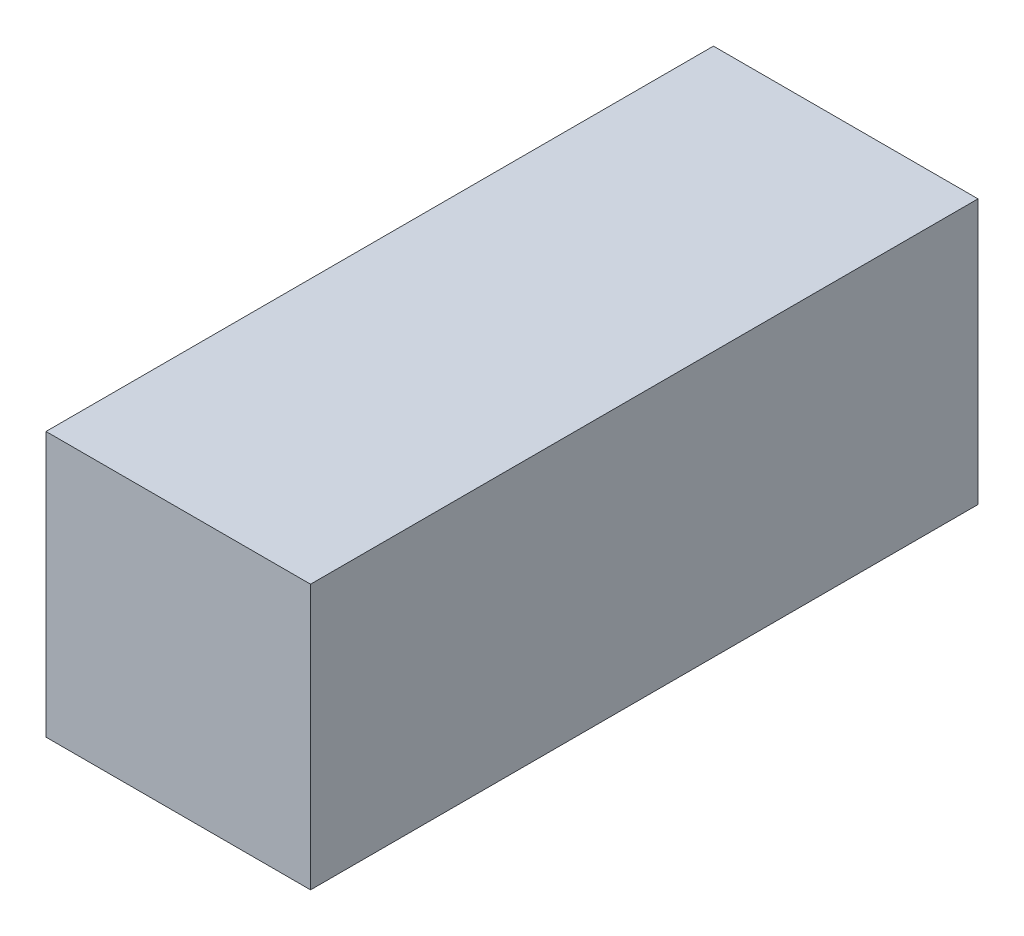
ISO-10303-21;
HEADER;
FILE_DESCRIPTION(('STEP AP214'),'2;1');
FILE_NAME('part.step','',(''),(''),'','','');
FILE_SCHEMA(('AUTOMOTIVE_DESIGN { 1 0 10303 214 1 1 1 1 }'));
ENDSEC;
DATA;
#1=APPLICATION_CONTEXT('core data for automotive mechanical design processes');
#2=APPLICATION_PROTOCOL_DEFINITION('international standard','automotive_design',2000,#1);
#3=PRODUCT_CONTEXT('',#1,'mechanical');
#4=PRODUCT('Part','Part','',(#3));
#5=PRODUCT_RELATED_PRODUCT_CATEGORY('part','',(#4));
#6=PRODUCT_DEFINITION_FORMATION('','',#4);
#7=PRODUCT_DEFINITION_CONTEXT('part definition',#1,'design');
#8=PRODUCT_DEFINITION('design','',#6,#7);
#9=PRODUCT_DEFINITION_SHAPE('','',#8);
#10=(LENGTH_UNIT() NAMED_UNIT(*) SI_UNIT(.MILLI.,.METRE.));
#11=(NAMED_UNIT(*) PLANE_ANGLE_UNIT() SI_UNIT($,.RADIAN.));
#12=(NAMED_UNIT(*) SI_UNIT($,.STERADIAN.) SOLID_ANGLE_UNIT());
#13=UNCERTAINTY_MEASURE_WITH_UNIT(LENGTH_MEASURE(1.E-05),#10,'distance_accuracy_value','');
#14=(GEOMETRIC_REPRESENTATION_CONTEXT(3) GLOBAL_UNCERTAINTY_ASSIGNED_CONTEXT((#13)) GLOBAL_UNIT_ASSIGNED_CONTEXT((#10,
#11,#12)) REPRESENTATION_CONTEXT('',''));
#15=CARTESIAN_POINT('',(0.,0.,0.));
#16=DIRECTION('',(0.,0.,1.));
#17=DIRECTION('',(1.,0.,0.));
#18=AXIS2_PLACEMENT_3D('',#15,#16,#17);
#19=CARTESIAN_POINT('',(-9.243,5.8375,-21.));
#20=DIRECTION('',(1.,0.,0.));
#21=DIRECTION('',(0.,0.,-1.));
#22=AXIS2_PLACEMENT_3D('',#19,#20,#21);
#23=PLANE('',#22);
#24=DIRECTION('',(0.,-1.,0.));
#25=VECTOR('',#24,1.);
#26=CARTESIAN_POINT('',(-9.243,5.8375,-22.6));
#27=LINE('',#26,#25);
#28=CARTESIAN_POINT('',(-9.243,5.8375,-22.6));
#29=VERTEX_POINT('',#28);
#30=CARTESIAN_POINT('',(-9.243,5.20286408001963,-22.6));
#31=VERTEX_POINT('',#30);
#32=EDGE_CURVE('E11',#29,#31,#27,.T.);
#33=ORIENTED_EDGE('',*,*,#32,.T.);
#34=DIRECTION('',(0.,0.,-1.));
#35=VECTOR('',#34,1.);
#36=CARTESIAN_POINT('',(-9.243,5.20286408001963,-21.));
#37=LINE('',#36,#35);
#38=CARTESIAN_POINT('',(-9.243,5.20286408001963,-21.));
#39=VERTEX_POINT('',#38);
#40=EDGE_CURVE('E24',#39,#31,#37,.T.);
#41=ORIENTED_EDGE('',*,*,#40,.F.);
#42=DIRECTION('',(0.,-1.,0.));
#43=VECTOR('',#42,1.);
#44=CARTESIAN_POINT('',(-9.243,5.8375,-21.));
#45=LINE('',#44,#43);
#46=CARTESIAN_POINT('',(-9.243,5.8375,-21.));
#47=VERTEX_POINT('',#46);
#48=EDGE_CURVE('E88',#47,#39,#45,.T.);
#49=ORIENTED_EDGE('',*,*,#48,.F.);
#50=DIRECTION('',(0.,0.,-1.));
#51=VECTOR('',#50,1.);
#52=CARTESIAN_POINT('',(-9.243,5.8375,-21.));
#53=LINE('',#52,#51);
#54=EDGE_CURVE('E77',#47,#29,#53,.T.);
#55=ORIENTED_EDGE('',*,*,#54,.T.);
#56=EDGE_LOOP('',(#33,#41,#49,#55));
#57=FACE_BOUND('',#56,.T.);
#58=ADVANCED_FACE('F17',(#57),#23,.F.);
#59=CARTESIAN_POINT('',(-9.243,5.20286408001963,-21.));
#60=DIRECTION('',(0.,1.,0.));
#61=DIRECTION('',(0.,0.,1.));
#62=AXIS2_PLACEMENT_3D('',#59,#60,#61);
#63=PLANE('',#62);
#64=DIRECTION('',(1.,0.,0.));
#65=VECTOR('',#64,1.);
#66=CARTESIAN_POINT('',(-9.243,5.20286408001963,-22.6));
#67=LINE('',#66,#65);
#68=CARTESIAN_POINT('',(-8.6088347320442,5.20286408001963,-22.6));
#69=VERTEX_POINT('',#68);
#70=EDGE_CURVE('E85',#31,#69,#67,.T.);
#71=ORIENTED_EDGE('',*,*,#70,.T.);
#72=DIRECTION('',(0.,0.,-1.));
#73=VECTOR('',#72,1.);
#74=CARTESIAN_POINT('',(-8.6088347320442,5.20286408001963,-21.));
#75=LINE('',#74,#73);
#76=CARTESIAN_POINT('',(-8.6088347320442,5.20286408001963,-21.));
#77=VERTEX_POINT('',#76);
#78=EDGE_CURVE('E83',#77,#69,#75,.T.);
#79=ORIENTED_EDGE('',*,*,#78,.F.);
#80=DIRECTION('',(1.,0.,0.));
#81=VECTOR('',#80,1.);
#82=CARTESIAN_POINT('',(-9.243,5.20286408001963,-21.));
#83=LINE('',#82,#81);
#84=EDGE_CURVE('E72',#39,#77,#83,.T.);
#85=ORIENTED_EDGE('',*,*,#84,.F.);
#86=ORIENTED_EDGE('',*,*,#40,.T.);
#87=EDGE_LOOP('',(#71,#79,#85,#86));
#88=FACE_BOUND('',#87,.T.);
#89=ADVANCED_FACE('F90',(#88),#63,.F.);
#90=CARTESIAN_POINT('',(-8.6088347320442,5.8375,-21.));
#91=DIRECTION('',(-1.,0.,0.));
#92=DIRECTION('',(0.,0.,1.));
#93=AXIS2_PLACEMENT_3D('',#90,#91,#92);
#94=PLANE('',#93);
#95=DIRECTION('',(0.,1.,0.));
#96=VECTOR('',#95,1.);
#97=CARTESIAN_POINT('',(-8.6088347320442,5.8375,-22.6));
#98=LINE('',#97,#96);
#99=CARTESIAN_POINT('',(-8.6088347320442,5.8375,-22.6));
#100=VERTEX_POINT('',#99);
#101=EDGE_CURVE('E60',#69,#100,#98,.T.);
#102=ORIENTED_EDGE('',*,*,#101,.T.);
#103=DIRECTION('',(0.,0.,-1.));
#104=VECTOR('',#103,1.);
#105=CARTESIAN_POINT('',(-8.6088347320442,5.8375,-21.));
#106=LINE('',#105,#104);
#107=CARTESIAN_POINT('',(-8.6088347320442,5.8375,-21.));
#108=VERTEX_POINT('',#107);
#109=EDGE_CURVE('E54',#108,#100,#106,.T.);
#110=ORIENTED_EDGE('',*,*,#109,.F.);
#111=DIRECTION('',(0.,1.,0.));
#112=VECTOR('',#111,1.);
#113=CARTESIAN_POINT('',(-8.6088347320442,5.8375,-21.));
#114=LINE('',#113,#112);
#115=EDGE_CURVE('E58',#77,#108,#114,.T.);
#116=ORIENTED_EDGE('',*,*,#115,.F.);
#117=ORIENTED_EDGE('',*,*,#78,.T.);
#118=EDGE_LOOP('',(#102,#110,#116,#117));
#119=FACE_BOUND('',#118,.T.);
#120=ADVANCED_FACE('F56',(#119),#94,.F.);
#121=CARTESIAN_POINT('',(-9.243,5.8375,-21.));
#122=DIRECTION('',(0.,-1.,0.));
#123=DIRECTION('',(0.,0.,-1.));
#124=AXIS2_PLACEMENT_3D('',#121,#122,#123);
#125=PLANE('',#124);
#126=DIRECTION('',(-1.,0.,0.));
#127=VECTOR('',#126,1.);
#128=CARTESIAN_POINT('',(-9.243,5.8375,-22.6));
#129=LINE('',#128,#127);
#130=EDGE_CURVE('E73',#100,#29,#129,.T.);
#131=ORIENTED_EDGE('',*,*,#130,.T.);
#132=ORIENTED_EDGE('',*,*,#54,.F.);
#133=DIRECTION('',(-1.,0.,0.));
#134=VECTOR('',#133,1.);
#135=CARTESIAN_POINT('',(-9.243,5.8375,-21.));
#136=LINE('',#135,#134);
#137=EDGE_CURVE('E70',#108,#47,#136,.T.);
#138=ORIENTED_EDGE('',*,*,#137,.F.);
#139=ORIENTED_EDGE('',*,*,#109,.T.);
#140=EDGE_LOOP('',(#131,#132,#138,#139));
#141=FACE_BOUND('',#140,.T.);
#142=ADVANCED_FACE('F76',(#141),#125,.F.);
#143=CARTESIAN_POINT('',(0.,0.,-21.));
#144=DIRECTION('',(0.,0.,1.));
#145=DIRECTION('',(1.,0.,0.));
#146=AXIS2_PLACEMENT_3D('',#143,#144,#145);
#147=PLANE('',#146);
#148=ORIENTED_EDGE('',*,*,#48,.T.);
#149=ORIENTED_EDGE('',*,*,#84,.T.);
#150=ORIENTED_EDGE('',*,*,#115,.T.);
#151=ORIENTED_EDGE('',*,*,#137,.T.);
#152=EDGE_LOOP('',(#148,#149,#150,#151));
#153=FACE_BOUND('',#152,.T.);
#154=ADVANCED_FACE('F69',(#153),#147,.T.);
#155=CARTESIAN_POINT('',(0.,0.,-22.6));
#156=DIRECTION('',(0.,0.,1.));
#157=DIRECTION('',(1.,0.,0.));
#158=AXIS2_PLACEMENT_3D('',#155,#156,#157);
#159=PLANE('',#158);
#160=ORIENTED_EDGE('',*,*,#32,.F.);
#161=ORIENTED_EDGE('',*,*,#130,.F.);
#162=ORIENTED_EDGE('',*,*,#101,.F.);
#163=ORIENTED_EDGE('',*,*,#70,.F.);
#164=EDGE_LOOP('',(#160,#161,#162,#163));
#165=FACE_BOUND('',#164,.T.);
#166=ADVANCED_FACE('F91',(#165),#159,.F.);
#167=CLOSED_SHELL('',(#58,#89,#120,#142,#154,#166));
#168=MANIFOLD_SOLID_BREP('B1',#167);
#169=ADVANCED_BREP_SHAPE_REPRESENTATION('',(#18,#168),#14);
#170=SHAPE_DEFINITION_REPRESENTATION(#9,#169);
ENDSEC;
END-ISO-10303-21;
